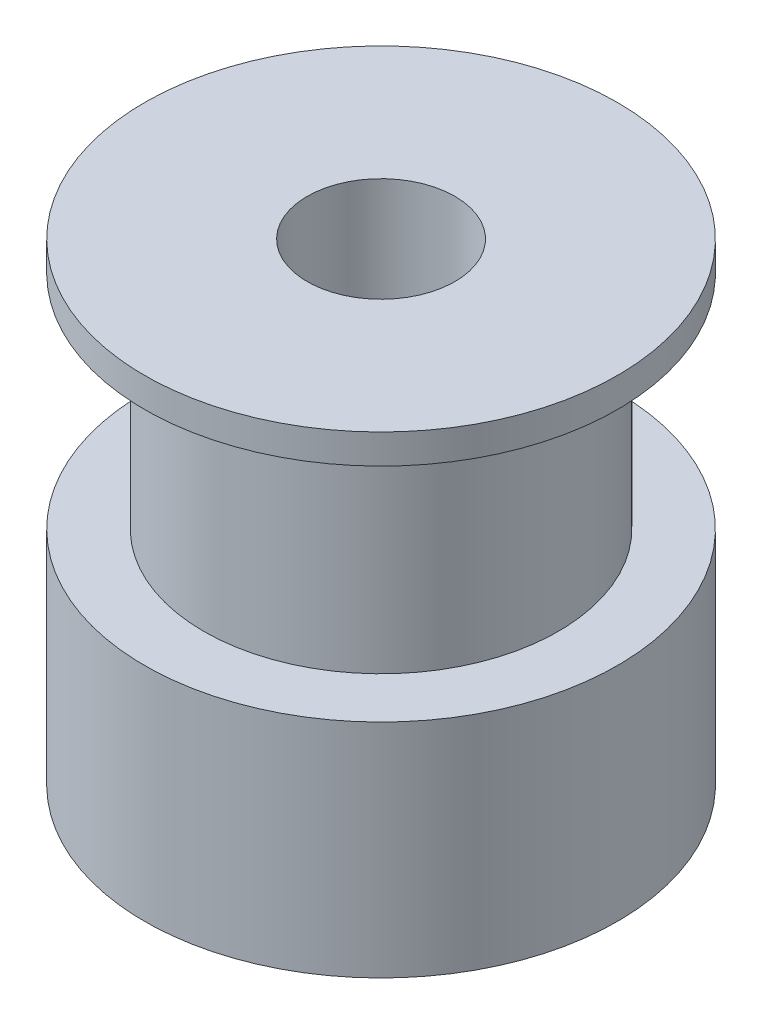
ISO-10303-21;
HEADER;
FILE_DESCRIPTION(('STEP AP214'),'2;1');
FILE_NAME('part.step','',(''),(''),'','','');
FILE_SCHEMA(('AUTOMOTIVE_DESIGN { 1 0 10303 214 1 1 1 1 }'));
ENDSEC;
DATA;
#1=APPLICATION_CONTEXT('core data for automotive mechanical design processes');
#2=APPLICATION_PROTOCOL_DEFINITION('international standard','automotive_design',2000,#1);
#3=PRODUCT_CONTEXT('',#1,'mechanical');
#4=PRODUCT('Part','Part','',(#3));
#5=PRODUCT_RELATED_PRODUCT_CATEGORY('part','',(#4));
#6=PRODUCT_DEFINITION_FORMATION('','',#4);
#7=PRODUCT_DEFINITION_CONTEXT('part definition',#1,'design');
#8=PRODUCT_DEFINITION('design','',#6,#7);
#9=PRODUCT_DEFINITION_SHAPE('','',#8);
#10=(LENGTH_UNIT() NAMED_UNIT(*) SI_UNIT(.MILLI.,.METRE.));
#11=(NAMED_UNIT(*) PLANE_ANGLE_UNIT() SI_UNIT($,.RADIAN.));
#12=(NAMED_UNIT(*) SI_UNIT($,.STERADIAN.) SOLID_ANGLE_UNIT());
#13=UNCERTAINTY_MEASURE_WITH_UNIT(LENGTH_MEASURE(1.E-05),#10,'distance_accuracy_value','');
#14=(GEOMETRIC_REPRESENTATION_CONTEXT(3) GLOBAL_UNCERTAINTY_ASSIGNED_CONTEXT((#13)) GLOBAL_UNIT_ASSIGNED_CONTEXT((#10,
#11,#12)) REPRESENTATION_CONTEXT('',''));
#15=CARTESIAN_POINT('',(0.,0.,0.));
#16=DIRECTION('',(0.,0.,1.));
#17=DIRECTION('',(1.,0.,0.));
#18=AXIS2_PLACEMENT_3D('',#15,#16,#17);
#19=CARTESIAN_POINT('',(8.,0.,0.));
#20=DIRECTION('',(0.,-1.,0.));
#21=DIRECTION('',(0.,0.,-1.));
#22=AXIS2_PLACEMENT_3D('',#19,#20,#21);
#23=PLANE('',#22);
#24=CARTESIAN_POINT('',(0.,0.,0.));
#25=DIRECTION('',(0.,-1.,0.));
#26=DIRECTION('',(0.,0.,-1.));
#27=AXIS2_PLACEMENT_3D('',#24,#25,#26);
#28=CIRCLE('',#27,8.);
#29=CARTESIAN_POINT('',(0.,0.,-8.));
#30=VERTEX_POINT('',#29);
#31=EDGE_CURVE('E10',#30,#30,#28,.T.);
#32=ORIENTED_EDGE('',*,*,#31,.T.);
#33=EDGE_LOOP('',(#32));
#34=FACE_BOUND('',#33,.T.);
#35=CARTESIAN_POINT('',(0.,0.,0.));
#36=DIRECTION('',(0.,-1.,0.));
#37=DIRECTION('',(0.,0.,-1.));
#38=AXIS2_PLACEMENT_3D('',#35,#36,#37);
#39=CIRCLE('',#38,2.5);
#40=CARTESIAN_POINT('',(0.,0.,-2.5));
#41=VERTEX_POINT('',#40);
#42=EDGE_CURVE('E59',#41,#41,#39,.T.);
#43=ORIENTED_EDGE('',*,*,#42,.F.);
#44=EDGE_LOOP('',(#43));
#45=FACE_BOUND('',#44,.T.);
#46=ADVANCED_FACE('F31',(#34,#45),#23,.T.);
#47=CARTESIAN_POINT('',(0.,0.,0.));
#48=DIRECTION('',(0.,-1.,0.));
#49=DIRECTION('',(0.,0.,-1.));
#50=AXIS2_PLACEMENT_3D('',#47,#48,#49);
#51=CYLINDRICAL_SURFACE('',#50,8.);
#52=CARTESIAN_POINT('',(0.,7.5,0.));
#53=DIRECTION('',(0.,-1.,0.));
#54=DIRECTION('',(0.,0.,-1.));
#55=AXIS2_PLACEMENT_3D('',#52,#53,#54);
#56=CIRCLE('',#55,8.);
#57=CARTESIAN_POINT('',(0.,7.5,-8.));
#58=VERTEX_POINT('',#57);
#59=EDGE_CURVE('E37',#58,#58,#56,.T.);
#60=ORIENTED_EDGE('',*,*,#59,.T.);
#61=EDGE_LOOP('',(#60));
#62=FACE_BOUND('',#61,.T.);
#63=ORIENTED_EDGE('',*,*,#31,.F.);
#64=EDGE_LOOP('',(#63));
#65=FACE_BOUND('',#64,.T.);
#66=ADVANCED_FACE('F67',(#62,#65),#51,.T.);
#67=CARTESIAN_POINT('',(8.,7.5,0.));
#68=DIRECTION('',(0.,1.,0.));
#69=DIRECTION('',(0.,0.,1.));
#70=AXIS2_PLACEMENT_3D('',#67,#68,#69);
#71=PLANE('',#70);
#72=CARTESIAN_POINT('',(0.,7.5,0.));
#73=DIRECTION('',(0.,-1.,0.));
#74=DIRECTION('',(0.,0.,-1.));
#75=AXIS2_PLACEMENT_3D('',#72,#73,#74);
#76=CIRCLE('',#75,6.);
#77=CARTESIAN_POINT('',(0.,7.5,-6.));
#78=VERTEX_POINT('',#77);
#79=EDGE_CURVE('E41',#78,#78,#76,.T.);
#80=ORIENTED_EDGE('',*,*,#79,.T.);
#81=EDGE_LOOP('',(#80));
#82=FACE_BOUND('',#81,.T.);
#83=ORIENTED_EDGE('',*,*,#59,.F.);
#84=EDGE_LOOP('',(#83));
#85=FACE_BOUND('',#84,.T.);
#86=ADVANCED_FACE('F71',(#82,#85),#71,.T.);
#87=CARTESIAN_POINT('',(0.,0.,0.));
#88=DIRECTION('',(0.,-1.,0.));
#89=DIRECTION('',(0.,0.,-1.));
#90=AXIS2_PLACEMENT_3D('',#87,#88,#89);
#91=CYLINDRICAL_SURFACE('',#90,6.);
#92=CARTESIAN_POINT('',(0.,15.,0.));
#93=DIRECTION('',(0.,-1.,0.));
#94=DIRECTION('',(0.,0.,-1.));
#95=AXIS2_PLACEMENT_3D('',#92,#93,#94);
#96=CIRCLE('',#95,6.);
#97=CARTESIAN_POINT('',(0.,15.,-6.));
#98=VERTEX_POINT('',#97);
#99=EDGE_CURVE('E45',#98,#98,#96,.T.);
#100=ORIENTED_EDGE('',*,*,#99,.T.);
#101=EDGE_LOOP('',(#100));
#102=FACE_BOUND('',#101,.T.);
#103=ORIENTED_EDGE('',*,*,#79,.F.);
#104=EDGE_LOOP('',(#103));
#105=FACE_BOUND('',#104,.T.);
#106=ADVANCED_FACE('F75',(#102,#105),#91,.T.);
#107=CARTESIAN_POINT('',(6.,15.,0.));
#108=DIRECTION('',(0.,-1.,0.));
#109=DIRECTION('',(0.,0.,-1.));
#110=AXIS2_PLACEMENT_3D('',#107,#108,#109);
#111=PLANE('',#110);
#112=CARTESIAN_POINT('',(0.,15.,0.));
#113=DIRECTION('',(0.,-1.,0.));
#114=DIRECTION('',(0.,0.,-1.));
#115=AXIS2_PLACEMENT_3D('',#112,#113,#114);
#116=CIRCLE('',#115,8.);
#117=CARTESIAN_POINT('',(0.,15.,-8.));
#118=VERTEX_POINT('',#117);
#119=EDGE_CURVE('E50',#118,#118,#116,.T.);
#120=ORIENTED_EDGE('',*,*,#119,.T.);
#121=EDGE_LOOP('',(#120));
#122=FACE_BOUND('',#121,.T.);
#123=ORIENTED_EDGE('',*,*,#99,.F.);
#124=EDGE_LOOP('',(#123));
#125=FACE_BOUND('',#124,.T.);
#126=ADVANCED_FACE('F82',(#122,#125),#111,.T.);
#127=CARTESIAN_POINT('',(0.,0.,0.));
#128=DIRECTION('',(0.,-1.,0.));
#129=DIRECTION('',(0.,0.,-1.));
#130=AXIS2_PLACEMENT_3D('',#127,#128,#129);
#131=CYLINDRICAL_SURFACE('',#130,8.);
#132=CARTESIAN_POINT('',(0.,16.,0.));
#133=DIRECTION('',(0.,-1.,0.));
#134=DIRECTION('',(0.,0.,-1.));
#135=AXIS2_PLACEMENT_3D('',#132,#133,#134);
#136=CIRCLE('',#135,8.);
#137=CARTESIAN_POINT('',(0.,16.,-8.));
#138=VERTEX_POINT('',#137);
#139=EDGE_CURVE('E53',#138,#138,#136,.T.);
#140=ORIENTED_EDGE('',*,*,#139,.T.);
#141=EDGE_LOOP('',(#140));
#142=FACE_BOUND('',#141,.T.);
#143=ORIENTED_EDGE('',*,*,#119,.F.);
#144=EDGE_LOOP('',(#143));
#145=FACE_BOUND('',#144,.T.);
#146=ADVANCED_FACE('F86',(#142,#145),#131,.T.);
#147=CARTESIAN_POINT('',(8.,16.,0.));
#148=DIRECTION('',(0.,1.,0.));
#149=DIRECTION('',(0.,0.,1.));
#150=AXIS2_PLACEMENT_3D('',#147,#148,#149);
#151=PLANE('',#150);
#152=CARTESIAN_POINT('',(0.,16.,0.));
#153=DIRECTION('',(0.,-1.,0.));
#154=DIRECTION('',(0.,0.,-1.));
#155=AXIS2_PLACEMENT_3D('',#152,#153,#154);
#156=CIRCLE('',#155,2.5);
#157=CARTESIAN_POINT('',(0.,16.,-2.5));
#158=VERTEX_POINT('',#157);
#159=EDGE_CURVE('E56',#158,#158,#156,.T.);
#160=ORIENTED_EDGE('',*,*,#159,.T.);
#161=EDGE_LOOP('',(#160));
#162=FACE_BOUND('',#161,.T.);
#163=ORIENTED_EDGE('',*,*,#139,.F.);
#164=EDGE_LOOP('',(#163));
#165=FACE_BOUND('',#164,.T.);
#166=ADVANCED_FACE('F90',(#162,#165),#151,.T.);
#167=CARTESIAN_POINT('',(0.,0.,0.));
#168=DIRECTION('',(0.,-1.,0.));
#169=DIRECTION('',(0.,0.,-1.));
#170=AXIS2_PLACEMENT_3D('',#167,#168,#169);
#171=CYLINDRICAL_SURFACE('',#170,2.5);
#172=ORIENTED_EDGE('',*,*,#42,.T.);
#173=EDGE_LOOP('',(#172));
#174=FACE_BOUND('',#173,.T.);
#175=ORIENTED_EDGE('',*,*,#159,.F.);
#176=EDGE_LOOP('',(#175));
#177=FACE_BOUND('',#176,.T.);
#178=ADVANCED_FACE('F63',(#174,#177),#171,.F.);
#179=CLOSED_SHELL('',(#46,#66,#86,#106,#126,#146,#166,#178));
#180=MANIFOLD_SOLID_BREP('B2',#179);
#181=ADVANCED_BREP_SHAPE_REPRESENTATION('',(#18,#180),#14);
#182=SHAPE_DEFINITION_REPRESENTATION(#9,#181);
ENDSEC;
END-ISO-10303-21;
